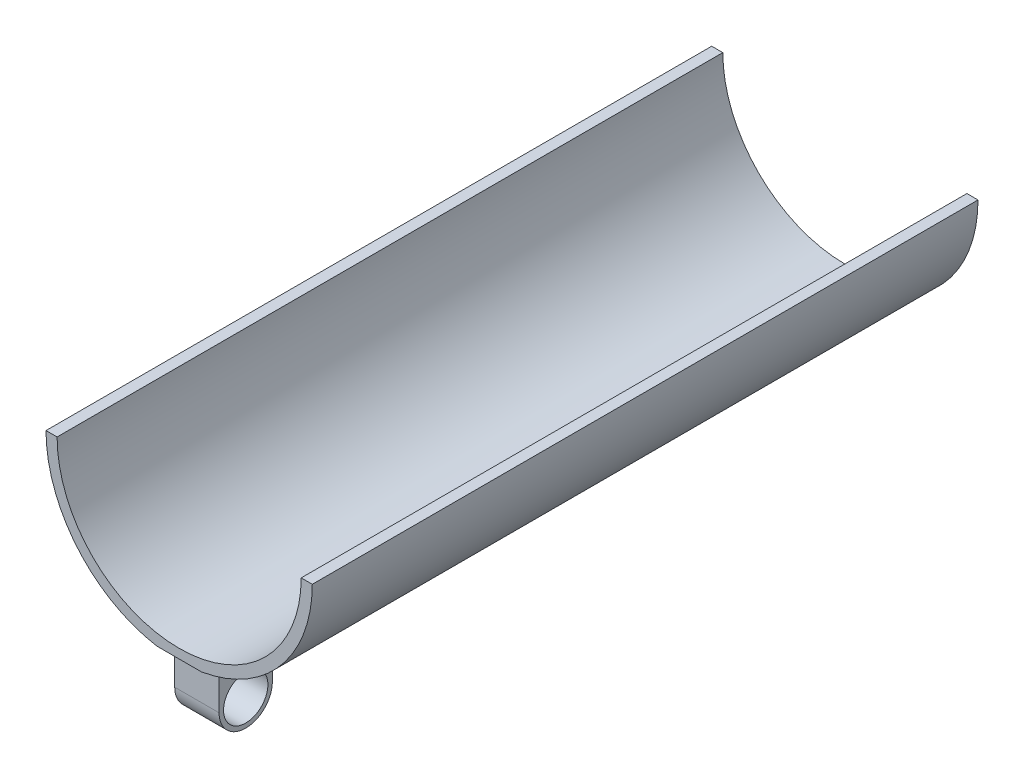
ISO-10303-21;
HEADER;
FILE_DESCRIPTION(('STEP AP214'),'2;1');
FILE_NAME('part.step','',(''),(''),'','','');
FILE_SCHEMA(('AUTOMOTIVE_DESIGN { 1 0 10303 214 1 1 1 1 }'));
ENDSEC;
DATA;
#1=APPLICATION_CONTEXT('core data for automotive mechanical design processes');
#2=APPLICATION_PROTOCOL_DEFINITION('international standard','automotive_design',2000,#1);
#3=PRODUCT_CONTEXT('',#1,'mechanical');
#4=PRODUCT('Part','Part','',(#3));
#5=PRODUCT_RELATED_PRODUCT_CATEGORY('part','',(#4));
#6=PRODUCT_DEFINITION_FORMATION('','',#4);
#7=PRODUCT_DEFINITION_CONTEXT('part definition',#1,'design');
#8=PRODUCT_DEFINITION('design','',#6,#7);
#9=PRODUCT_DEFINITION_SHAPE('','',#8);
#10=(LENGTH_UNIT() NAMED_UNIT(*) SI_UNIT(.MILLI.,.METRE.));
#11=(NAMED_UNIT(*) PLANE_ANGLE_UNIT() SI_UNIT($,.RADIAN.));
#12=(NAMED_UNIT(*) SI_UNIT($,.STERADIAN.) SOLID_ANGLE_UNIT());
#13=UNCERTAINTY_MEASURE_WITH_UNIT(LENGTH_MEASURE(1.E-05),#10,'distance_accuracy_value','');
#14=(GEOMETRIC_REPRESENTATION_CONTEXT(3) GLOBAL_UNCERTAINTY_ASSIGNED_CONTEXT((#13)) GLOBAL_UNIT_ASSIGNED_CONTEXT((#10,
#11,#12)) REPRESENTATION_CONTEXT('',''));
#15=CARTESIAN_POINT('',(0.,0.,0.));
#16=DIRECTION('',(0.,0.,1.));
#17=DIRECTION('',(1.,0.,0.));
#18=AXIS2_PLACEMENT_3D('',#15,#16,#17);
#19=CARTESIAN_POINT('',(-5.,0.,130.));
#20=DIRECTION('',(-1.,0.,0.));
#21=DIRECTION('',(0.,-1.,0.));
#22=AXIS2_PLACEMENT_3D('',#19,#20,#21);
#23=PLANE('',#22);
#24=CARTESIAN_POINT('',(-5.00000000000001,-39.5803989154981,140.));
#25=DIRECTION('',(-1.,0.,0.));
#26=DIRECTION('',(0.,-1.,0.));
#27=AXIS2_PLACEMENT_3D('',#24,#25,#26);
#28=CIRCLE('',#27,5.00000000000002);
#29=CARTESIAN_POINT('',(-5.00000000000001,-44.5803989154981,140.));
#30=VERTEX_POINT('',#29);
#31=EDGE_CURVE('E190',#30,#30,#28,.T.);
#32=ORIENTED_EDGE('',*,*,#31,.F.);
#33=EDGE_LOOP('',(#32));
#34=FACE_BOUND('',#33,.T.);
#35=DIRECTION('',(0.,0.,1.));
#36=VECTOR('',#35,1.);
#37=CARTESIAN_POINT('',(-5.,-29.5803989154981,130.));
#38=LINE('',#37,#36);
#39=CARTESIAN_POINT('',(-5.,-29.5803989154981,134.));
#40=VERTEX_POINT('',#39);
#41=CARTESIAN_POINT('',(-5.,-29.5803989154981,146.));
#42=VERTEX_POINT('',#41);
#43=EDGE_CURVE('E203',#40,#42,#38,.T.);
#44=ORIENTED_EDGE('',*,*,#43,.F.);
#45=DIRECTION('',(0.,1.,0.));
#46=VECTOR('',#45,1.);
#47=CARTESIAN_POINT('',(-5.,0.,134.));
#48=LINE('',#47,#46);
#49=CARTESIAN_POINT('',(-4.99999999999999,-39.5803989154981,134.));
#50=VERTEX_POINT('',#49);
#51=EDGE_CURVE('E137',#50,#40,#48,.T.);
#52=ORIENTED_EDGE('',*,*,#51,.F.);
#53=CARTESIAN_POINT('',(-4.99999999999999,-39.5803989154981,140.));
#54=DIRECTION('',(1.,0.,0.));
#55=DIRECTION('',(0.,1.,0.));
#56=AXIS2_PLACEMENT_3D('',#53,#54,#55);
#57=CIRCLE('',#56,6.00000000000002);
#58=CARTESIAN_POINT('',(-4.99999999999999,-39.5803989154981,146.));
#59=VERTEX_POINT('',#58);
#60=EDGE_CURVE('E130',#59,#50,#57,.T.);
#61=ORIENTED_EDGE('',*,*,#60,.F.);
#62=DIRECTION('',(0.,1.,0.));
#63=VECTOR('',#62,1.);
#64=CARTESIAN_POINT('',(-5.,0.,146.));
#65=LINE('',#64,#63);
#66=EDGE_CURVE('E140',#59,#42,#65,.T.);
#67=ORIENTED_EDGE('',*,*,#66,.T.);
#68=EDGE_LOOP('',(#44,#52,#61,#67));
#69=FACE_BOUND('',#68,.T.);
#70=ADVANCED_FACE('F46',(#34,#69),#23,.T.);
#71=CARTESIAN_POINT('',(5.,0.,130.));
#72=DIRECTION('',(-1.,0.,0.));
#73=DIRECTION('',(0.,-1.,0.));
#74=AXIS2_PLACEMENT_3D('',#71,#72,#73);
#75=PLANE('',#74);
#76=CARTESIAN_POINT('',(5.00000000000001,-39.5803989154981,140.));
#77=DIRECTION('',(1.,0.,0.));
#78=DIRECTION('',(0.,1.,0.));
#79=AXIS2_PLACEMENT_3D('',#76,#77,#78);
#80=CIRCLE('',#79,5.00000000000002);
#81=CARTESIAN_POINT('',(5.,-34.5803989154981,140.));
#82=VERTEX_POINT('',#81);
#83=EDGE_CURVE('E173',#82,#82,#80,.T.);
#84=ORIENTED_EDGE('',*,*,#83,.F.);
#85=EDGE_LOOP('',(#84));
#86=FACE_BOUND('',#85,.T.);
#87=DIRECTION('',(0.,1.,0.));
#88=VECTOR('',#87,1.);
#89=CARTESIAN_POINT('',(5.,0.,134.));
#90=LINE('',#89,#88);
#91=CARTESIAN_POINT('',(5.00000000000001,-39.5803989154981,134.));
#92=VERTEX_POINT('',#91);
#93=CARTESIAN_POINT('',(5.,-29.5803989154981,134.));
#94=VERTEX_POINT('',#93);
#95=EDGE_CURVE('E151',#92,#94,#90,.T.);
#96=ORIENTED_EDGE('',*,*,#95,.T.);
#97=DIRECTION('',(0.,0.,1.));
#98=VECTOR('',#97,1.);
#99=CARTESIAN_POINT('',(5.,-29.5803989154981,130.));
#100=LINE('',#99,#98);
#101=CARTESIAN_POINT('',(5.,-29.5803989154981,146.));
#102=VERTEX_POINT('',#101);
#103=EDGE_CURVE('E197',#94,#102,#100,.T.);
#104=ORIENTED_EDGE('',*,*,#103,.T.);
#105=DIRECTION('',(0.,1.,0.));
#106=VECTOR('',#105,1.);
#107=CARTESIAN_POINT('',(5.,0.,146.));
#108=LINE('',#107,#106);
#109=CARTESIAN_POINT('',(5.00000000000001,-39.5803989154981,146.));
#110=VERTEX_POINT('',#109);
#111=EDGE_CURVE('E165',#110,#102,#108,.T.);
#112=ORIENTED_EDGE('',*,*,#111,.F.);
#113=CARTESIAN_POINT('',(5.00000000000001,-39.5803989154981,140.));
#114=DIRECTION('',(1.,0.,0.));
#115=DIRECTION('',(0.,1.,0.));
#116=AXIS2_PLACEMENT_3D('',#113,#114,#115);
#117=CIRCLE('',#116,6.00000000000002);
#118=EDGE_CURVE('E62',#110,#92,#117,.T.);
#119=ORIENTED_EDGE('',*,*,#118,.T.);
#120=EDGE_LOOP('',(#96,#104,#112,#119));
#121=FACE_BOUND('',#120,.T.);
#122=ADVANCED_FACE('F257',(#86,#121),#75,.F.);
#123=CARTESIAN_POINT('',(0.,0.,150.));
#124=DIRECTION('',(0.,0.,-1.));
#125=DIRECTION('',(-1.,0.,0.));
#126=AXIS2_PLACEMENT_3D('',#123,#124,#125);
#127=CYLINDRICAL_SURFACE('',#126,27.5);
#128=CARTESIAN_POINT('',(0.,0.,0.));
#129=DIRECTION('',(0.,0.,1.));
#130=DIRECTION('',(1.,0.,0.));
#131=AXIS2_PLACEMENT_3D('',#128,#129,#130);
#132=CIRCLE('',#131,27.5);
#133=CARTESIAN_POINT('',(-27.5,0.,0.));
#134=VERTEX_POINT('',#133);
#135=CARTESIAN_POINT('',(27.5,0.,0.));
#136=VERTEX_POINT('',#135);
#137=EDGE_CURVE('E202',#134,#136,#132,.T.);
#138=ORIENTED_EDGE('',*,*,#137,.F.);
#139=DIRECTION('',(0.,0.,-1.));
#140=VECTOR('',#139,1.);
#141=CARTESIAN_POINT('',(-27.5,0.,150.));
#142=LINE('',#141,#140);
#143=CARTESIAN_POINT('',(-27.5,0.,150.));
#144=VERTEX_POINT('',#143);
#145=EDGE_CURVE('E11',#144,#134,#142,.T.);
#146=ORIENTED_EDGE('',*,*,#145,.F.);
#147=CARTESIAN_POINT('',(0.,0.,150.));
#148=DIRECTION('',(0.,0.,1.));
#149=DIRECTION('',(1.,0.,0.));
#150=AXIS2_PLACEMENT_3D('',#147,#148,#149);
#151=CIRCLE('',#150,27.5);
#152=CARTESIAN_POINT('',(27.5,0.,150.));
#153=VERTEX_POINT('',#152);
#154=EDGE_CURVE('E208',#144,#153,#151,.T.);
#155=ORIENTED_EDGE('',*,*,#154,.T.);
#156=DIRECTION('',(0.,0.,-1.));
#157=VECTOR('',#156,1.);
#158=CARTESIAN_POINT('',(27.5,0.,150.));
#159=LINE('',#158,#157);
#160=EDGE_CURVE('E71',#153,#136,#159,.T.);
#161=ORIENTED_EDGE('',*,*,#160,.T.);
#162=EDGE_LOOP('',(#138,#146,#155,#161));
#163=FACE_BOUND('',#162,.T.);
#164=ADVANCED_FACE('F48',(#163),#127,.F.);
#165=CARTESIAN_POINT('',(0.,0.,150.));
#166=DIRECTION('',(0.,1.,0.));
#167=DIRECTION('',(0.,0.,1.));
#168=AXIS2_PLACEMENT_3D('',#165,#166,#167);
#169=PLANE('',#168);
#170=DIRECTION('',(1.,0.,0.));
#171=VECTOR('',#170,1.);
#172=CARTESIAN_POINT('',(0.,0.,0.));
#173=LINE('',#172,#171);
#174=CARTESIAN_POINT('',(-30.,0.,0.));
#175=VERTEX_POINT('',#174);
#176=EDGE_CURVE('E224',#175,#134,#173,.T.);
#177=ORIENTED_EDGE('',*,*,#176,.F.);
#178=DIRECTION('',(0.,0.,-1.));
#179=VECTOR('',#178,1.);
#180=CARTESIAN_POINT('',(-30.,0.,150.));
#181=LINE('',#180,#179);
#182=CARTESIAN_POINT('',(-30.,0.,150.));
#183=VERTEX_POINT('',#182);
#184=EDGE_CURVE('E55',#183,#175,#181,.T.);
#185=ORIENTED_EDGE('',*,*,#184,.F.);
#186=DIRECTION('',(1.,0.,0.));
#187=VECTOR('',#186,1.);
#188=CARTESIAN_POINT('',(0.,0.,150.));
#189=LINE('',#188,#187);
#190=EDGE_CURVE('E211',#183,#144,#189,.T.);
#191=ORIENTED_EDGE('',*,*,#190,.T.);
#192=ORIENTED_EDGE('',*,*,#145,.T.);
#193=EDGE_LOOP('',(#177,#185,#191,#192));
#194=FACE_BOUND('',#193,.T.);
#195=ADVANCED_FACE('F249',(#194),#169,.T.);
#196=CARTESIAN_POINT('',(0.,0.,150.));
#197=DIRECTION('',(0.,0.,-1.));
#198=DIRECTION('',(-1.,0.,0.));
#199=AXIS2_PLACEMENT_3D('',#196,#197,#198);
#200=CYLINDRICAL_SURFACE('',#199,30.);
#201=CARTESIAN_POINT('',(0.,0.,130.));
#202=DIRECTION('',(0.,0.,1.));
#203=DIRECTION('',(1.,0.,0.));
#204=AXIS2_PLACEMENT_3D('',#201,#202,#203);
#205=CIRCLE('',#204,30.);
#206=CARTESIAN_POINT('',(-5.,-29.5803989154981,130.));
#207=VERTEX_POINT('',#206);
#208=CARTESIAN_POINT('',(5.,-29.5803989154981,130.));
#209=VERTEX_POINT('',#208);
#210=EDGE_CURVE('E194',#207,#209,#205,.T.);
#211=ORIENTED_EDGE('',*,*,#210,.F.);
#212=EDGE_CURVE('E198',#207,#40,#38,.T.);
#213=ORIENTED_EDGE('',*,*,#212,.T.);
#214=ORIENTED_EDGE('',*,*,#43,.T.);
#215=DIRECTION('',(0.,0.,1.));
#216=VECTOR('',#215,1.);
#217=CARTESIAN_POINT('',(-5.,-29.5803989154981,0.));
#218=LINE('',#217,#216);
#219=CARTESIAN_POINT('',(-5.,-29.5803989154981,150.));
#220=VERTEX_POINT('',#219);
#221=EDGE_CURVE('E147',#42,#220,#218,.T.);
#222=ORIENTED_EDGE('',*,*,#221,.T.);
#223=CARTESIAN_POINT('',(0.,0.,150.));
#224=DIRECTION('',(0.,0.,1.));
#225=DIRECTION('',(1.,0.,0.));
#226=AXIS2_PLACEMENT_3D('',#223,#224,#225);
#227=CIRCLE('',#226,30.);
#228=EDGE_CURVE('E218',#183,#220,#227,.T.);
#229=ORIENTED_EDGE('',*,*,#228,.F.);
#230=ORIENTED_EDGE('',*,*,#184,.T.);
#231=CARTESIAN_POINT('',(0.,0.,0.));
#232=DIRECTION('',(0.,0.,1.));
#233=DIRECTION('',(1.,0.,0.));
#234=AXIS2_PLACEMENT_3D('',#231,#232,#233);
#235=CIRCLE('',#234,30.);
#236=CARTESIAN_POINT('',(30.,0.,0.));
#237=VERTEX_POINT('',#236);
#238=EDGE_CURVE('E228',#175,#237,#235,.T.);
#239=ORIENTED_EDGE('',*,*,#238,.T.);
#240=DIRECTION('',(0.,0.,-1.));
#241=VECTOR('',#240,1.);
#242=CARTESIAN_POINT('',(30.,0.,150.));
#243=LINE('',#242,#241);
#244=CARTESIAN_POINT('',(30.,0.,150.));
#245=VERTEX_POINT('',#244);
#246=EDGE_CURVE('E234',#245,#237,#243,.T.);
#247=ORIENTED_EDGE('',*,*,#246,.F.);
#248=CARTESIAN_POINT('',(5.,-29.5803989154981,150.));
#249=VERTEX_POINT('',#248);
#250=EDGE_CURVE('E216',#249,#245,#227,.T.);
#251=ORIENTED_EDGE('',*,*,#250,.F.);
#252=DIRECTION('',(0.,0.,1.));
#253=VECTOR('',#252,1.);
#254=CARTESIAN_POINT('',(5.,-29.5803989154981,0.));
#255=LINE('',#254,#253);
#256=EDGE_CURVE('E155',#102,#249,#255,.T.);
#257=ORIENTED_EDGE('',*,*,#256,.F.);
#258=ORIENTED_EDGE('',*,*,#103,.F.);
#259=EDGE_CURVE('E204',#209,#94,#100,.T.);
#260=ORIENTED_EDGE('',*,*,#259,.F.);
#261=EDGE_LOOP('',(#211,#213,#214,#222,#229,#230,#239,#247,#251,#257,#258,#260));
#262=FACE_BOUND('',#261,.T.);
#263=ADVANCED_FACE('F241',(#262),#200,.T.);
#264=EDGE_CURVE('E212',#136,#237,#173,.T.);
#265=ORIENTED_EDGE('',*,*,#264,.F.);
#266=ORIENTED_EDGE('',*,*,#160,.F.);
#267=EDGE_CURVE('E217',#153,#245,#189,.T.);
#268=ORIENTED_EDGE('',*,*,#267,.T.);
#269=ORIENTED_EDGE('',*,*,#246,.T.);
#270=EDGE_LOOP('',(#265,#266,#268,#269));
#271=FACE_BOUND('',#270,.T.);
#272=ADVANCED_FACE('F250',(#271),#169,.T.);
#273=CARTESIAN_POINT('',(0.,0.,150.));
#274=DIRECTION('',(0.,0.,1.));
#275=DIRECTION('',(1.,0.,0.));
#276=AXIS2_PLACEMENT_3D('',#273,#274,#275);
#277=PLANE('',#276);
#278=DIRECTION('',(1.,0.,0.));
#279=VECTOR('',#278,1.);
#280=CARTESIAN_POINT('',(-5.,-29.5803989154981,150.));
#281=LINE('',#280,#279);
#282=EDGE_CURVE('E181',#220,#249,#281,.T.);
#283=ORIENTED_EDGE('',*,*,#282,.T.);
#284=ORIENTED_EDGE('',*,*,#250,.T.);
#285=ORIENTED_EDGE('',*,*,#267,.F.);
#286=ORIENTED_EDGE('',*,*,#154,.F.);
#287=ORIENTED_EDGE('',*,*,#190,.F.);
#288=ORIENTED_EDGE('',*,*,#228,.T.);
#289=EDGE_LOOP('',(#283,#284,#285,#286,#287,#288));
#290=FACE_BOUND('',#289,.T.);
#291=ADVANCED_FACE('F264',(#290),#277,.T.);
#292=CARTESIAN_POINT('',(0.,0.,0.));
#293=DIRECTION('',(0.,0.,1.));
#294=DIRECTION('',(1.,0.,0.));
#295=AXIS2_PLACEMENT_3D('',#292,#293,#294);
#296=PLANE('',#295);
#297=ORIENTED_EDGE('',*,*,#137,.T.);
#298=ORIENTED_EDGE('',*,*,#264,.T.);
#299=ORIENTED_EDGE('',*,*,#238,.F.);
#300=ORIENTED_EDGE('',*,*,#176,.T.);
#301=EDGE_LOOP('',(#297,#298,#299,#300));
#302=FACE_BOUND('',#301,.T.);
#303=ADVANCED_FACE('F248',(#302),#296,.F.);
#304=CARTESIAN_POINT('',(-15.,-39.5803989154981,140.));
#305=DIRECTION('',(1.,0.,0.));
#306=DIRECTION('',(0.,1.,0.));
#307=AXIS2_PLACEMENT_3D('',#304,#305,#306);
#308=CYLINDRICAL_SURFACE('',#307,5.00000000000002);
#309=ORIENTED_EDGE('',*,*,#31,.T.);
#310=EDGE_LOOP('',(#309));
#311=FACE_BOUND('',#310,.T.);
#312=ORIENTED_EDGE('',*,*,#83,.T.);
#313=EDGE_LOOP('',(#312));
#314=FACE_BOUND('',#313,.T.);
#315=ADVANCED_FACE('F275',(#311,#314),#308,.F.);
#316=CARTESIAN_POINT('',(-5.,0.,130.));
#317=DIRECTION('',(0.,0.,-1.));
#318=DIRECTION('',(-1.,0.,0.));
#319=AXIS2_PLACEMENT_3D('',#316,#317,#318);
#320=PLANE('',#319);
#321=DIRECTION('',(1.,0.,0.));
#322=VECTOR('',#321,1.);
#323=CARTESIAN_POINT('',(-5.,-29.5803989154981,130.));
#324=LINE('',#323,#322);
#325=EDGE_CURVE('E177',#207,#209,#324,.T.);
#326=ORIENTED_EDGE('',*,*,#325,.F.);
#327=ORIENTED_EDGE('',*,*,#210,.T.);
#328=EDGE_LOOP('',(#326,#327));
#329=FACE_BOUND('',#328,.T.);
#330=ADVANCED_FACE('F291',(#329),#320,.F.);
#331=CARTESIAN_POINT('',(-4.99999999999999,-39.5803989154981,140.));
#332=DIRECTION('',(1.,0.,0.));
#333=DIRECTION('',(0.,1.,0.));
#334=AXIS2_PLACEMENT_3D('',#331,#332,#333);
#335=CYLINDRICAL_SURFACE('',#334,6.00000000000002);
#336=ORIENTED_EDGE('',*,*,#118,.F.);
#337=DIRECTION('',(1.,0.,0.));
#338=VECTOR('',#337,1.);
#339=CARTESIAN_POINT('',(-4.99999999999999,-39.5803989154981,146.));
#340=LINE('',#339,#338);
#341=EDGE_CURVE('E126',#59,#110,#340,.T.);
#342=ORIENTED_EDGE('',*,*,#341,.F.);
#343=ORIENTED_EDGE('',*,*,#60,.T.);
#344=DIRECTION('',(1.,0.,0.));
#345=VECTOR('',#344,1.);
#346=CARTESIAN_POINT('',(-4.99999999999999,-39.5803989154981,134.));
#347=LINE('',#346,#345);
#348=EDGE_CURVE('E170',#50,#92,#347,.T.);
#349=ORIENTED_EDGE('',*,*,#348,.T.);
#350=EDGE_LOOP('',(#336,#342,#343,#349));
#351=FACE_BOUND('',#350,.T.);
#352=ADVANCED_FACE('F128',(#351),#335,.T.);
#353=CARTESIAN_POINT('',(-5.,0.,134.));
#354=DIRECTION('',(0.,0.,-1.));
#355=DIRECTION('',(-1.,0.,0.));
#356=AXIS2_PLACEMENT_3D('',#353,#354,#355);
#357=PLANE('',#356);
#358=ORIENTED_EDGE('',*,*,#95,.F.);
#359=ORIENTED_EDGE('',*,*,#348,.F.);
#360=ORIENTED_EDGE('',*,*,#51,.T.);
#361=DIRECTION('',(1.,0.,0.));
#362=VECTOR('',#361,1.);
#363=CARTESIAN_POINT('',(-5.,-29.5803989154981,134.));
#364=LINE('',#363,#362);
#365=EDGE_CURVE('E174',#40,#94,#364,.T.);
#366=ORIENTED_EDGE('',*,*,#365,.T.);
#367=EDGE_LOOP('',(#358,#359,#360,#366));
#368=FACE_BOUND('',#367,.T.);
#369=ADVANCED_FACE('F295',(#368),#357,.T.);
#370=CARTESIAN_POINT('',(-5.,-29.5803989154981,0.));
#371=DIRECTION('',(0.,1.,0.));
#372=DIRECTION('',(-1.,0.,0.));
#373=AXIS2_PLACEMENT_3D('',#370,#371,#372);
#374=PLANE('',#373);
#375=ORIENTED_EDGE('',*,*,#259,.T.);
#376=ORIENTED_EDGE('',*,*,#365,.F.);
#377=ORIENTED_EDGE('',*,*,#212,.F.);
#378=ORIENTED_EDGE('',*,*,#325,.T.);
#379=EDGE_LOOP('',(#375,#376,#377,#378));
#380=FACE_BOUND('',#379,.T.);
#381=ADVANCED_FACE('F300',(#380),#374,.F.);
#382=ORIENTED_EDGE('',*,*,#256,.T.);
#383=ORIENTED_EDGE('',*,*,#282,.F.);
#384=ORIENTED_EDGE('',*,*,#221,.F.);
#385=DIRECTION('',(1.,0.,0.));
#386=VECTOR('',#385,1.);
#387=CARTESIAN_POINT('',(-5.,-29.5803989154981,146.));
#388=LINE('',#387,#386);
#389=EDGE_CURVE('E136',#42,#102,#388,.T.);
#390=ORIENTED_EDGE('',*,*,#389,.T.);
#391=EDGE_LOOP('',(#382,#383,#384,#390));
#392=FACE_BOUND('',#391,.T.);
#393=ADVANCED_FACE('F262',(#392),#374,.F.);
#394=CARTESIAN_POINT('',(-5.,0.,146.));
#395=DIRECTION('',(0.,0.,-1.));
#396=DIRECTION('',(-1.,0.,0.));
#397=AXIS2_PLACEMENT_3D('',#394,#395,#396);
#398=PLANE('',#397);
#399=ORIENTED_EDGE('',*,*,#111,.T.);
#400=ORIENTED_EDGE('',*,*,#389,.F.);
#401=ORIENTED_EDGE('',*,*,#66,.F.);
#402=ORIENTED_EDGE('',*,*,#341,.T.);
#403=EDGE_LOOP('',(#399,#400,#401,#402));
#404=FACE_BOUND('',#403,.T.);
#405=ADVANCED_FACE('F141',(#404),#398,.F.);
#406=CLOSED_SHELL('',(#70,#122,#164,#195,#263,#272,#291,#303,#315,#330,#352,#369,#381,#393,#405));
#407=MANIFOLD_SOLID_BREP('B2',#406);
#408=ADVANCED_BREP_SHAPE_REPRESENTATION('',(#18,#407),#14);
#409=SHAPE_DEFINITION_REPRESENTATION(#9,#408);
ENDSEC;
END-ISO-10303-21;
